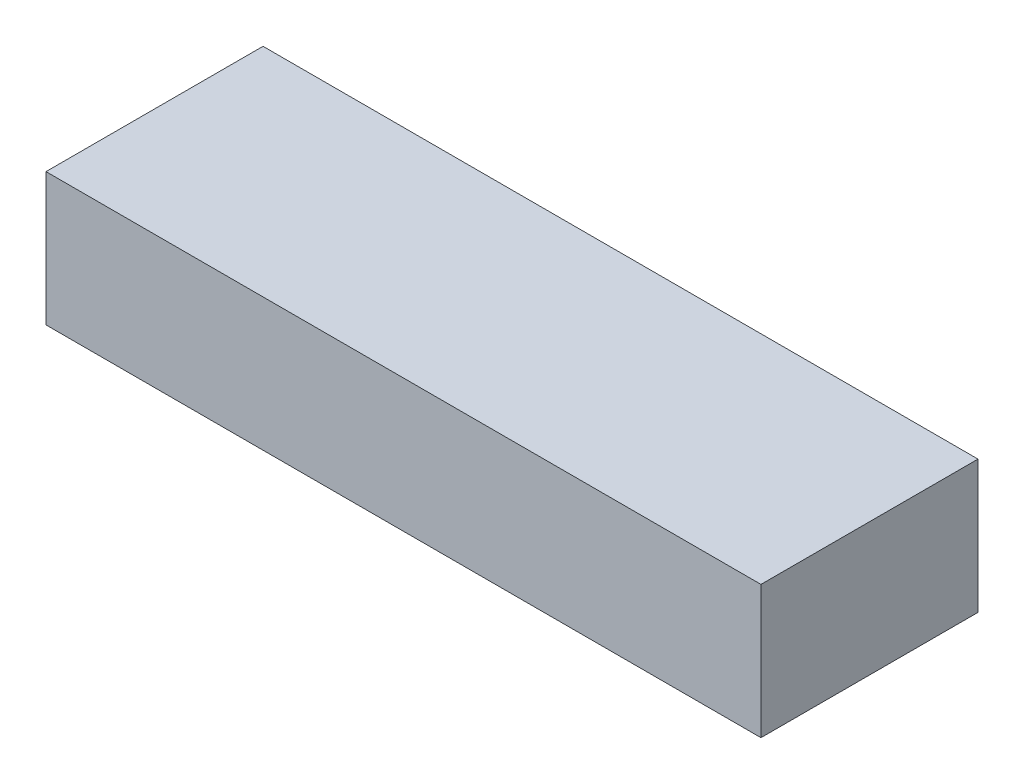
ISO-10303-21;
HEADER;
FILE_DESCRIPTION(('STEP AP214'),'2;1');
FILE_NAME('part.step','',(''),(''),'','','');
FILE_SCHEMA(('AUTOMOTIVE_DESIGN { 1 0 10303 214 1 1 1 1 }'));
ENDSEC;
DATA;
#1=APPLICATION_CONTEXT('core data for automotive mechanical design processes');
#2=APPLICATION_PROTOCOL_DEFINITION('international standard','automotive_design',2000,#1);
#3=PRODUCT_CONTEXT('',#1,'mechanical');
#4=PRODUCT('Part','Part','',(#3));
#5=PRODUCT_RELATED_PRODUCT_CATEGORY('part','',(#4));
#6=PRODUCT_DEFINITION_FORMATION('','',#4);
#7=PRODUCT_DEFINITION_CONTEXT('part definition',#1,'design');
#8=PRODUCT_DEFINITION('design','',#6,#7);
#9=PRODUCT_DEFINITION_SHAPE('','',#8);
#10=(LENGTH_UNIT() NAMED_UNIT(*) SI_UNIT(.MILLI.,.METRE.));
#11=(NAMED_UNIT(*) PLANE_ANGLE_UNIT() SI_UNIT($,.RADIAN.));
#12=(NAMED_UNIT(*) SI_UNIT($,.STERADIAN.) SOLID_ANGLE_UNIT());
#13=UNCERTAINTY_MEASURE_WITH_UNIT(LENGTH_MEASURE(1.E-05),#10,'distance_accuracy_value','');
#14=(GEOMETRIC_REPRESENTATION_CONTEXT(3) GLOBAL_UNCERTAINTY_ASSIGNED_CONTEXT((#13)) GLOBAL_UNIT_ASSIGNED_CONTEXT((#10,
#11,#12)) REPRESENTATION_CONTEXT('',''));
#15=CARTESIAN_POINT('',(0.,0.,0.));
#16=DIRECTION('',(0.,0.,1.));
#17=DIRECTION('',(1.,0.,0.));
#18=AXIS2_PLACEMENT_3D('',#15,#16,#17);
#19=CARTESIAN_POINT('',(70.,-13.,21.25));
#20=DIRECTION('',(1.,0.,0.));
#21=DIRECTION('',(0.,0.,-1.));
#22=AXIS2_PLACEMENT_3D('',#19,#20,#21);
#23=PLANE('',#22);
#24=DIRECTION('',(0.,1.,0.));
#25=VECTOR('',#24,1.);
#26=CARTESIAN_POINT('',(70.,-13.,-21.25));
#27=LINE('',#26,#25);
#28=CARTESIAN_POINT('',(70.,-13.,-21.25));
#29=VERTEX_POINT('',#28);
#30=CARTESIAN_POINT('',(70.,13.,-21.25));
#31=VERTEX_POINT('',#30);
#32=EDGE_CURVE('E42',#29,#31,#27,.T.);
#33=ORIENTED_EDGE('',*,*,#32,.T.);
#34=DIRECTION('',(0.,0.,-1.));
#35=VECTOR('',#34,1.);
#36=CARTESIAN_POINT('',(70.,13.,21.25));
#37=LINE('',#36,#35);
#38=CARTESIAN_POINT('',(70.,13.,21.25));
#39=VERTEX_POINT('',#38);
#40=EDGE_CURVE('E80',#39,#31,#37,.T.);
#41=ORIENTED_EDGE('',*,*,#40,.F.);
#42=DIRECTION('',(0.,1.,0.));
#43=VECTOR('',#42,1.);
#44=CARTESIAN_POINT('',(70.,-13.,21.25));
#45=LINE('',#44,#43);
#46=CARTESIAN_POINT('',(70.,-13.,21.25));
#47=VERTEX_POINT('',#46);
#48=EDGE_CURVE('E11',#47,#39,#45,.T.);
#49=ORIENTED_EDGE('',*,*,#48,.F.);
#50=DIRECTION('',(0.,0.,-1.));
#51=VECTOR('',#50,1.);
#52=CARTESIAN_POINT('',(70.,-13.,21.25));
#53=LINE('',#52,#51);
#54=EDGE_CURVE('E81',#47,#29,#53,.T.);
#55=ORIENTED_EDGE('',*,*,#54,.T.);
#56=EDGE_LOOP('',(#33,#41,#49,#55));
#57=FACE_BOUND('',#56,.T.);
#58=ADVANCED_FACE('F39',(#57),#23,.T.);
#59=CARTESIAN_POINT('',(-70.,-13.,21.25));
#60=DIRECTION('',(0.,0.,1.));
#61=DIRECTION('',(1.,0.,0.));
#62=AXIS2_PLACEMENT_3D('',#59,#60,#61);
#63=PLANE('',#62);
#64=ORIENTED_EDGE('',*,*,#48,.T.);
#65=DIRECTION('',(1.,0.,0.));
#66=VECTOR('',#65,1.);
#67=CARTESIAN_POINT('',(-70.,13.,21.25));
#68=LINE('',#67,#66);
#69=CARTESIAN_POINT('',(-70.,13.,21.25));
#70=VERTEX_POINT('',#69);
#71=EDGE_CURVE('E99',#70,#39,#68,.T.);
#72=ORIENTED_EDGE('',*,*,#71,.F.);
#73=DIRECTION('',(0.,1.,0.));
#74=VECTOR('',#73,1.);
#75=CARTESIAN_POINT('',(-70.,-13.,21.25));
#76=LINE('',#75,#74);
#77=CARTESIAN_POINT('',(-70.,-13.,21.25));
#78=VERTEX_POINT('',#77);
#79=EDGE_CURVE('E48',#78,#70,#76,.T.);
#80=ORIENTED_EDGE('',*,*,#79,.F.);
#81=DIRECTION('',(1.,0.,0.));
#82=VECTOR('',#81,1.);
#83=CARTESIAN_POINT('',(-70.,-13.,21.25));
#84=LINE('',#83,#82);
#85=EDGE_CURVE('E87',#78,#47,#84,.T.);
#86=ORIENTED_EDGE('',*,*,#85,.T.);
#87=EDGE_LOOP('',(#64,#72,#80,#86));
#88=FACE_BOUND('',#87,.T.);
#89=ADVANCED_FACE('F123',(#88),#63,.T.);
#90=CARTESIAN_POINT('',(-70.,-13.,21.25));
#91=DIRECTION('',(-1.,0.,0.));
#92=DIRECTION('',(0.,0.,1.));
#93=AXIS2_PLACEMENT_3D('',#90,#91,#92);
#94=PLANE('',#93);
#95=ORIENTED_EDGE('',*,*,#79,.T.);
#96=DIRECTION('',(0.,0.,1.));
#97=VECTOR('',#96,1.);
#98=CARTESIAN_POINT('',(-70.,13.,21.25));
#99=LINE('',#98,#97);
#100=CARTESIAN_POINT('',(-70.,13.,-21.25));
#101=VERTEX_POINT('',#100);
#102=EDGE_CURVE('E95',#101,#70,#99,.T.);
#103=ORIENTED_EDGE('',*,*,#102,.F.);
#104=DIRECTION('',(0.,1.,0.));
#105=VECTOR('',#104,1.);
#106=CARTESIAN_POINT('',(-70.,-13.,-21.25));
#107=LINE('',#106,#105);
#108=CARTESIAN_POINT('',(-70.,-13.,-21.25));
#109=VERTEX_POINT('',#108);
#110=EDGE_CURVE('E86',#109,#101,#107,.T.);
#111=ORIENTED_EDGE('',*,*,#110,.F.);
#112=DIRECTION('',(0.,0.,1.));
#113=VECTOR('',#112,1.);
#114=CARTESIAN_POINT('',(-70.,-13.,21.25));
#115=LINE('',#114,#113);
#116=EDGE_CURVE('E112',#109,#78,#115,.T.);
#117=ORIENTED_EDGE('',*,*,#116,.T.);
#118=EDGE_LOOP('',(#95,#103,#111,#117));
#119=FACE_BOUND('',#118,.T.);
#120=ADVANCED_FACE('F120',(#119),#94,.T.);
#121=CARTESIAN_POINT('',(-70.,-13.,-21.25));
#122=DIRECTION('',(0.,0.,-1.));
#123=DIRECTION('',(-1.,0.,0.));
#124=AXIS2_PLACEMENT_3D('',#121,#122,#123);
#125=PLANE('',#124);
#126=ORIENTED_EDGE('',*,*,#110,.T.);
#127=DIRECTION('',(-1.,0.,0.));
#128=VECTOR('',#127,1.);
#129=CARTESIAN_POINT('',(-70.,13.,-21.25));
#130=LINE('',#129,#128);
#131=EDGE_CURVE('E89',#31,#101,#130,.T.);
#132=ORIENTED_EDGE('',*,*,#131,.F.);
#133=ORIENTED_EDGE('',*,*,#32,.F.);
#134=DIRECTION('',(-1.,0.,0.));
#135=VECTOR('',#134,1.);
#136=CARTESIAN_POINT('',(-70.,-13.,-21.25));
#137=LINE('',#136,#135);
#138=EDGE_CURVE('E109',#29,#109,#137,.T.);
#139=ORIENTED_EDGE('',*,*,#138,.T.);
#140=EDGE_LOOP('',(#126,#132,#133,#139));
#141=FACE_BOUND('',#140,.T.);
#142=ADVANCED_FACE('F90',(#141),#125,.T.);
#143=CARTESIAN_POINT('',(0.,-13.,0.));
#144=DIRECTION('',(0.,-1.,0.));
#145=DIRECTION('',(0.,0.,-1.));
#146=AXIS2_PLACEMENT_3D('',#143,#144,#145);
#147=PLANE('',#146);
#148=ORIENTED_EDGE('',*,*,#54,.F.);
#149=ORIENTED_EDGE('',*,*,#85,.F.);
#150=ORIENTED_EDGE('',*,*,#116,.F.);
#151=ORIENTED_EDGE('',*,*,#138,.F.);
#152=EDGE_LOOP('',(#148,#149,#150,#151));
#153=FACE_BOUND('',#152,.T.);
#154=ADVANCED_FACE('F125',(#153),#147,.T.);
#155=CARTESIAN_POINT('',(0.,13.,0.));
#156=DIRECTION('',(0.,-1.,0.));
#157=DIRECTION('',(0.,0.,-1.));
#158=AXIS2_PLACEMENT_3D('',#155,#156,#157);
#159=PLANE('',#158);
#160=ORIENTED_EDGE('',*,*,#40,.T.);
#161=ORIENTED_EDGE('',*,*,#131,.T.);
#162=ORIENTED_EDGE('',*,*,#102,.T.);
#163=ORIENTED_EDGE('',*,*,#71,.T.);
#164=EDGE_LOOP('',(#160,#161,#162,#163));
#165=FACE_BOUND('',#164,.T.);
#166=ADVANCED_FACE('F98',(#165),#159,.F.);
#167=CLOSED_SHELL('',(#58,#89,#120,#142,#154,#166));
#168=MANIFOLD_SOLID_BREP('B2',#167);
#169=ADVANCED_BREP_SHAPE_REPRESENTATION('',(#18,#168),#14);
#170=SHAPE_DEFINITION_REPRESENTATION(#9,#169);
ENDSEC;
END-ISO-10303-21;
